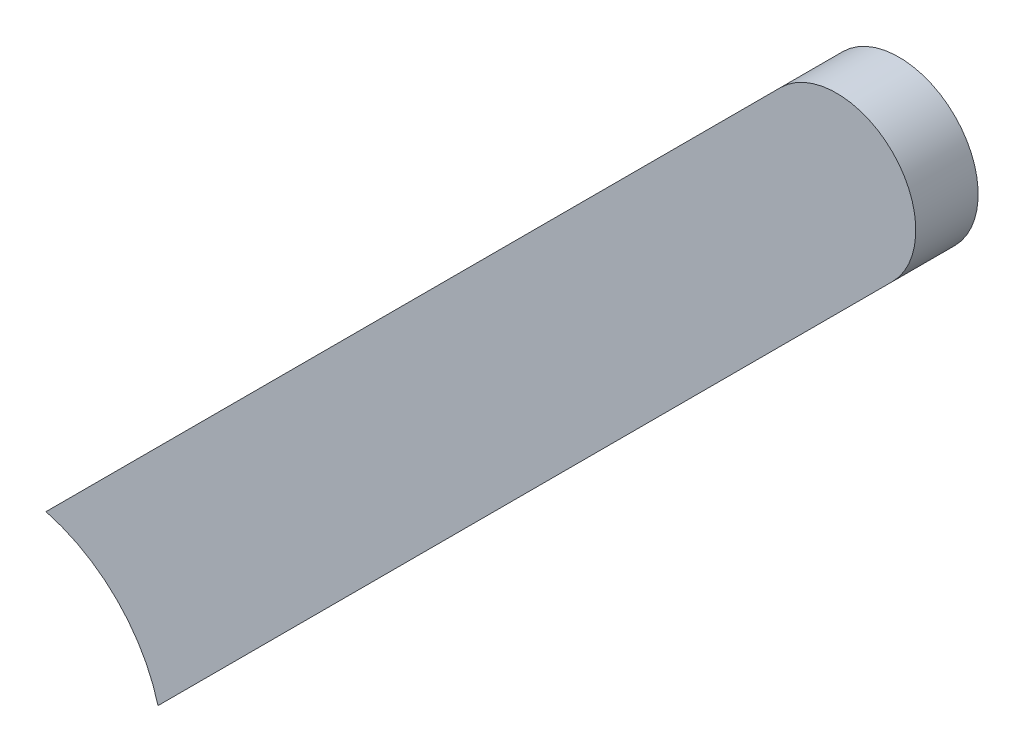
ISO-10303-21;
HEADER;
FILE_DESCRIPTION(('STEP AP214'),'2;1');
FILE_NAME('part.step','',(''),(''),'','','');
FILE_SCHEMA(('AUTOMOTIVE_DESIGN { 1 0 10303 214 1 1 1 1 }'));
ENDSEC;
DATA;
#1=APPLICATION_CONTEXT('core data for automotive mechanical design processes');
#2=APPLICATION_PROTOCOL_DEFINITION('international standard','automotive_design',2000,#1);
#3=PRODUCT_CONTEXT('',#1,'mechanical');
#4=PRODUCT('Part','Part','',(#3));
#5=PRODUCT_RELATED_PRODUCT_CATEGORY('part','',(#4));
#6=PRODUCT_DEFINITION_FORMATION('','',#4);
#7=PRODUCT_DEFINITION_CONTEXT('part definition',#1,'design');
#8=PRODUCT_DEFINITION('design','',#6,#7);
#9=PRODUCT_DEFINITION_SHAPE('','',#8);
#10=(LENGTH_UNIT() NAMED_UNIT(*) SI_UNIT(.MILLI.,.METRE.));
#11=(NAMED_UNIT(*) PLANE_ANGLE_UNIT() SI_UNIT($,.RADIAN.));
#12=(NAMED_UNIT(*) SI_UNIT($,.STERADIAN.) SOLID_ANGLE_UNIT());
#13=UNCERTAINTY_MEASURE_WITH_UNIT(LENGTH_MEASURE(1.E-05),#10,'distance_accuracy_value','');
#14=(GEOMETRIC_REPRESENTATION_CONTEXT(3) GLOBAL_UNCERTAINTY_ASSIGNED_CONTEXT((#13)) GLOBAL_UNIT_ASSIGNED_CONTEXT((#10,
#11,#12)) REPRESENTATION_CONTEXT('',''));
#15=CARTESIAN_POINT('',(0.,0.,0.));
#16=DIRECTION('',(0.,0.,1.));
#17=DIRECTION('',(1.,0.,0.));
#18=AXIS2_PLACEMENT_3D('',#15,#16,#17);
#19=CARTESIAN_POINT('',(153.271690665303,94.2384787853028,0.));
#20=DIRECTION('',(-0.707106781186548,0.707106781186548,0.));
#21=DIRECTION('',(0.707106781186548,0.707106781186548,0.));
#22=AXIS2_PLACEMENT_3D('',#19,#20,#21);
#23=PLANE('',#22);
#24=DIRECTION('',(0.707106781186548,0.707106781186548,0.));
#25=VECTOR('',#24,1.);
#26=CARTESIAN_POINT('',(152.96060594,93.92739406,0.1999996));
#27=LINE('',#26,#25);
#28=CARTESIAN_POINT('',(153.271690665303,94.2384787853028,0.1999996));
#29=VERTEX_POINT('',#28);
#30=CARTESIAN_POINT('',(155.62760594,96.59439406,0.1999996));
#31=VERTEX_POINT('',#30);
#32=EDGE_CURVE('E11',#29,#31,#27,.T.);
#33=ORIENTED_EDGE('',*,*,#32,.F.);
#34=DIRECTION('',(0.,0.,1.));
#35=VECTOR('',#34,1.);
#36=CARTESIAN_POINT('',(153.271690665303,94.2384787853028,0.));
#37=LINE('',#36,#35);
#38=CARTESIAN_POINT('',(153.271690665303,94.2384787853028,0.));
#39=VERTEX_POINT('',#38);
#40=EDGE_CURVE('E24',#39,#29,#37,.T.);
#41=ORIENTED_EDGE('',*,*,#40,.F.);
#42=DIRECTION('',(0.707106781186548,0.707106781186548,0.));
#43=VECTOR('',#42,1.);
#44=CARTESIAN_POINT('',(152.96060594,93.92739406,0.));
#45=LINE('',#44,#43);
#46=CARTESIAN_POINT('',(155.62760594,96.59439406,0.));
#47=VERTEX_POINT('',#46);
#48=EDGE_CURVE('E75',#39,#47,#45,.T.);
#49=ORIENTED_EDGE('',*,*,#48,.T.);
#50=DIRECTION('',(0.,0.,1.));
#51=VECTOR('',#50,1.);
#52=CARTESIAN_POINT('',(155.62760594,96.59439406,0.));
#53=LINE('',#52,#51);
#54=EDGE_CURVE('E37',#47,#31,#53,.T.);
#55=ORIENTED_EDGE('',*,*,#54,.T.);
#56=EDGE_LOOP('',(#33,#41,#49,#55));
#57=FACE_BOUND('',#56,.T.);
#58=ADVANCED_FACE('F17',(#57),#23,.F.);
#59=CARTESIAN_POINT('',(155.448,96.774,0.));
#60=DIRECTION('',(0.,0.,-1.));
#61=DIRECTION('',(0.707106781186576,-0.70710678118652,0.));
#62=AXIS2_PLACEMENT_3D('',#59,#60,#61);
#63=CYLINDRICAL_SURFACE('',#62,0.254001156230768);
#64=CARTESIAN_POINT('',(155.448,96.774,0.1999996));
#65=DIRECTION('',(0.,0.,1.));
#66=DIRECTION('',(0.707106781186576,-0.70710678118652,0.));
#67=AXIS2_PLACEMENT_3D('',#64,#65,#66);
#68=CIRCLE('',#67,0.254001156230768);
#69=CARTESIAN_POINT('',(155.26839406,96.95360594,0.1999996));
#70=VERTEX_POINT('',#69);
#71=EDGE_CURVE('E83',#31,#70,#68,.T.);
#72=ORIENTED_EDGE('',*,*,#71,.F.);
#73=ORIENTED_EDGE('',*,*,#54,.F.);
#74=CARTESIAN_POINT('',(155.448,96.774,0.));
#75=DIRECTION('',(0.,0.,1.));
#76=DIRECTION('',(0.707106781186576,-0.70710678118652,0.));
#77=AXIS2_PLACEMENT_3D('',#74,#75,#76);
#78=CIRCLE('',#77,0.254001156230768);
#79=CARTESIAN_POINT('',(155.26839406,96.95360594,0.));
#80=VERTEX_POINT('',#79);
#81=EDGE_CURVE('E81',#47,#80,#78,.T.);
#82=ORIENTED_EDGE('',*,*,#81,.T.);
#83=DIRECTION('',(0.,0.,1.));
#84=VECTOR('',#83,1.);
#85=CARTESIAN_POINT('',(155.26839406,96.95360594,0.));
#86=LINE('',#85,#84);
#87=EDGE_CURVE('E67',#80,#70,#86,.T.);
#88=ORIENTED_EDGE('',*,*,#87,.T.);
#89=EDGE_LOOP('',(#72,#73,#82,#88));
#90=FACE_BOUND('',#89,.T.);
#91=ADVANCED_FACE('F89',(#90),#63,.T.);
#92=CARTESIAN_POINT('',(155.26839406,96.95360594,0.));
#93=DIRECTION('',(0.707106781186548,-0.707106781186548,0.));
#94=DIRECTION('',(-0.707106781186548,-0.707106781186548,0.));
#95=AXIS2_PLACEMENT_3D('',#92,#93,#94);
#96=PLANE('',#95);
#97=DIRECTION('',(-0.707106781186548,-0.707106781186548,0.));
#98=VECTOR('',#97,1.);
#99=CARTESIAN_POINT('',(155.26839406,96.95360594,0.1999996));
#100=LINE('',#99,#98);
#101=CARTESIAN_POINT('',(152.912478785303,94.5976906653028,0.1999996));
#102=VERTEX_POINT('',#101);
#103=EDGE_CURVE('E71',#70,#102,#100,.T.);
#104=ORIENTED_EDGE('',*,*,#103,.F.);
#105=ORIENTED_EDGE('',*,*,#87,.F.);
#106=DIRECTION('',(-0.707106781186548,-0.707106781186548,0.));
#107=VECTOR('',#106,1.);
#108=CARTESIAN_POINT('',(155.26839406,96.95360594,0.));
#109=LINE('',#108,#107);
#110=CARTESIAN_POINT('',(152.912478785303,94.5976906653028,0.));
#111=VERTEX_POINT('',#110);
#112=EDGE_CURVE('E63',#80,#111,#109,.T.);
#113=ORIENTED_EDGE('',*,*,#112,.T.);
#114=DIRECTION('',(0.,0.,1.));
#115=VECTOR('',#114,1.);
#116=CARTESIAN_POINT('',(152.912478785303,94.5976906653028,0.));
#117=LINE('',#116,#115);
#118=EDGE_CURVE('E53',#111,#102,#117,.T.);
#119=ORIENTED_EDGE('',*,*,#118,.T.);
#120=EDGE_LOOP('',(#104,#105,#113,#119));
#121=FACE_BOUND('',#120,.T.);
#122=ADVANCED_FACE('F66',(#121),#96,.F.);
#123=CARTESIAN_POINT('',(152.781,94.107,0.));
#124=DIRECTION('',(0.,0.,-1.));
#125=DIRECTION('',(1.,0.,0.));
#126=AXIS2_PLACEMENT_3D('',#123,#124,#125);
#127=CYLINDRICAL_SURFACE('',#126,0.508);
#128=ORIENTED_EDGE('',*,*,#40,.T.);
#129=CARTESIAN_POINT('',(152.781,94.107,0.1999996));
#130=DIRECTION('',(0.,0.,1.));
#131=DIRECTION('',(1.,0.,0.));
#132=AXIS2_PLACEMENT_3D('',#129,#130,#131);
#133=CIRCLE('',#132,0.508);
#134=EDGE_CURVE('E59',#29,#102,#133,.T.);
#135=ORIENTED_EDGE('',*,*,#134,.T.);
#136=ORIENTED_EDGE('',*,*,#118,.F.);
#137=CARTESIAN_POINT('',(152.781,94.107,0.));
#138=DIRECTION('',(0.,0.,1.));
#139=DIRECTION('',(1.,0.,0.));
#140=AXIS2_PLACEMENT_3D('',#137,#138,#139);
#141=CIRCLE('',#140,0.508);
#142=EDGE_CURVE('E57',#39,#111,#141,.T.);
#143=ORIENTED_EDGE('',*,*,#142,.F.);
#144=EDGE_LOOP('',(#128,#135,#136,#143));
#145=FACE_BOUND('',#144,.T.);
#146=ADVANCED_FACE('F55',(#145),#127,.F.);
#147=CARTESIAN_POINT('',(152.96060594,93.92739406,0.));
#148=DIRECTION('',(0.,0.,-1.));
#149=DIRECTION('',(-1.,0.,0.));
#150=AXIS2_PLACEMENT_3D('',#147,#148,#149);
#151=PLANE('',#150);
#152=ORIENTED_EDGE('',*,*,#48,.F.);
#153=ORIENTED_EDGE('',*,*,#142,.T.);
#154=ORIENTED_EDGE('',*,*,#112,.F.);
#155=ORIENTED_EDGE('',*,*,#81,.F.);
#156=EDGE_LOOP('',(#152,#153,#154,#155));
#157=FACE_BOUND('',#156,.T.);
#158=ADVANCED_FACE('F74',(#157),#151,.T.);
#159=CARTESIAN_POINT('',(152.96060594,93.92739406,0.1999996));
#160=DIRECTION('',(0.,0.,-1.));
#161=DIRECTION('',(-1.,0.,0.));
#162=AXIS2_PLACEMENT_3D('',#159,#160,#161);
#163=PLANE('',#162);
#164=ORIENTED_EDGE('',*,*,#134,.F.);
#165=ORIENTED_EDGE('',*,*,#32,.T.);
#166=ORIENTED_EDGE('',*,*,#71,.T.);
#167=ORIENTED_EDGE('',*,*,#103,.T.);
#168=EDGE_LOOP('',(#164,#165,#166,#167));
#169=FACE_BOUND('',#168,.T.);
#170=ADVANCED_FACE('F91',(#169),#163,.F.);
#171=CLOSED_SHELL('',(#58,#91,#122,#146,#158,#170));
#172=MANIFOLD_SOLID_BREP('B1',#171);
#173=ADVANCED_BREP_SHAPE_REPRESENTATION('',(#18,#172),#14);
#174=SHAPE_DEFINITION_REPRESENTATION(#9,#173);
ENDSEC;
END-ISO-10303-21;
